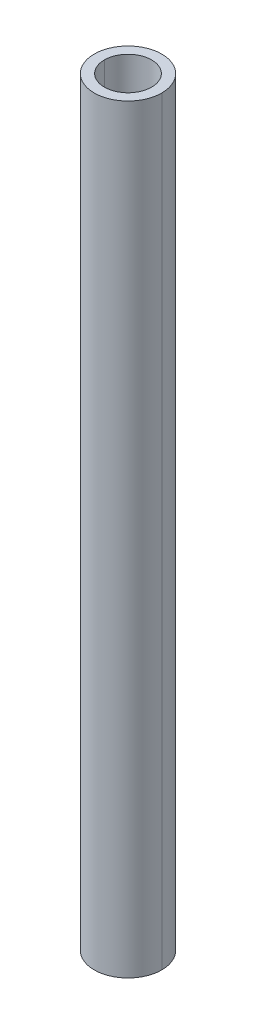
ISO-10303-21;
HEADER;
FILE_DESCRIPTION(('STEP AP214'),'2;1');
FILE_NAME('part.step','',(''),(''),'','','');
FILE_SCHEMA(('AUTOMOTIVE_DESIGN { 1 0 10303 214 1 1 1 1 }'));
ENDSEC;
DATA;
#1=APPLICATION_CONTEXT('core data for automotive mechanical design processes');
#2=APPLICATION_PROTOCOL_DEFINITION('international standard','automotive_design',2000,#1);
#3=PRODUCT_CONTEXT('',#1,'mechanical');
#4=PRODUCT('Part','Part','',(#3));
#5=PRODUCT_RELATED_PRODUCT_CATEGORY('part','',(#4));
#6=PRODUCT_DEFINITION_FORMATION('','',#4);
#7=PRODUCT_DEFINITION_CONTEXT('part definition',#1,'design');
#8=PRODUCT_DEFINITION('design','',#6,#7);
#9=PRODUCT_DEFINITION_SHAPE('','',#8);
#10=(LENGTH_UNIT() NAMED_UNIT(*) SI_UNIT(.MILLI.,.METRE.));
#11=(NAMED_UNIT(*) PLANE_ANGLE_UNIT() SI_UNIT($,.RADIAN.));
#12=(NAMED_UNIT(*) SI_UNIT($,.STERADIAN.) SOLID_ANGLE_UNIT());
#13=UNCERTAINTY_MEASURE_WITH_UNIT(LENGTH_MEASURE(1.E-05),#10,'distance_accuracy_value','');
#14=(GEOMETRIC_REPRESENTATION_CONTEXT(3) GLOBAL_UNCERTAINTY_ASSIGNED_CONTEXT((#13)) GLOBAL_UNIT_ASSIGNED_CONTEXT((#10,
#11,#12)) REPRESENTATION_CONTEXT('',''));
#15=CARTESIAN_POINT('',(0.,0.,0.));
#16=DIRECTION('',(0.,0.,1.));
#17=DIRECTION('',(1.,0.,0.));
#18=AXIS2_PLACEMENT_3D('',#15,#16,#17);
#19=CARTESIAN_POINT('',(98.9527027027026,199.398701769801,0.));
#20=DIRECTION('',(0.,1.,0.));
#21=DIRECTION('',(-1.,0.,0.));
#22=AXIS2_PLACEMENT_3D('',#19,#20,#21);
#23=CYLINDRICAL_SURFACE('',#22,10.);
#24=CARTESIAN_POINT('',(98.9527027027026,-103.885135135135,0.));
#25=DIRECTION('',(0.,1.,0.));
#26=DIRECTION('',(-1.,0.,0.));
#27=AXIS2_PLACEMENT_3D('',#24,#25,#26);
#28=CIRCLE('',#27,10.);
#29=CARTESIAN_POINT('',(88.9527027027027,-103.885135135135,0.));
#30=VERTEX_POINT('',#29);
#31=CARTESIAN_POINT('',(108.952702702703,-103.885135135135,0.));
#32=VERTEX_POINT('',#31);
#33=EDGE_CURVE('E11',#30,#32,#28,.T.);
#34=ORIENTED_EDGE('',*,*,#33,.T.);
#35=DIRECTION('',(0.,1.,0.));
#36=VECTOR('',#35,1.);
#37=CARTESIAN_POINT('',(108.952702702703,199.398701769801,0.));
#38=LINE('',#37,#36);
#39=CARTESIAN_POINT('',(108.952702702703,121.114864864865,0.));
#40=VERTEX_POINT('',#39);
#41=EDGE_CURVE('E28',#32,#40,#38,.T.);
#42=ORIENTED_EDGE('',*,*,#41,.T.);
#43=CARTESIAN_POINT('',(98.9527027027026,121.114864864865,0.));
#44=DIRECTION('',(0.,1.,0.));
#45=DIRECTION('',(-1.,0.,0.));
#46=AXIS2_PLACEMENT_3D('',#43,#44,#45);
#47=CIRCLE('',#46,10.);
#48=CARTESIAN_POINT('',(88.9527027027026,121.114864864865,0.));
#49=VERTEX_POINT('',#48);
#50=EDGE_CURVE('E59',#49,#40,#47,.T.);
#51=ORIENTED_EDGE('',*,*,#50,.F.);
#52=DIRECTION('',(0.,1.,0.));
#53=VECTOR('',#52,1.);
#54=CARTESIAN_POINT('',(88.9527027027026,199.398701769801,0.));
#55=LINE('',#54,#53);
#56=EDGE_CURVE('E21',#30,#49,#55,.T.);
#57=ORIENTED_EDGE('',*,*,#56,.F.);
#58=EDGE_LOOP('',(#34,#42,#51,#57));
#59=FACE_BOUND('',#58,.T.);
#60=ADVANCED_FACE('F17',(#59),#23,.T.);
#61=CARTESIAN_POINT('',(98.9527027027026,199.398701769801,0.));
#62=DIRECTION('',(0.,1.,0.));
#63=DIRECTION('',(-1.,0.,0.));
#64=AXIS2_PLACEMENT_3D('',#61,#62,#63);
#65=CYLINDRICAL_SURFACE('',#64,7.);
#66=CARTESIAN_POINT('',(98.9527027027026,-103.885135135135,0.));
#67=DIRECTION('',(0.,1.,0.));
#68=DIRECTION('',(-1.,0.,0.));
#69=AXIS2_PLACEMENT_3D('',#66,#67,#68);
#70=CIRCLE('',#69,7.);
#71=CARTESIAN_POINT('',(105.952702702703,-103.885135135135,0.));
#72=VERTEX_POINT('',#71);
#73=CARTESIAN_POINT('',(91.9527027027027,-103.885135135135,0.));
#74=VERTEX_POINT('',#73);
#75=EDGE_CURVE('E76',#72,#74,#70,.T.);
#76=ORIENTED_EDGE('',*,*,#75,.F.);
#77=DIRECTION('',(0.,1.,0.));
#78=VECTOR('',#77,1.);
#79=CARTESIAN_POINT('',(105.952702702703,199.398701769801,0.));
#80=LINE('',#79,#78);
#81=CARTESIAN_POINT('',(105.952702702703,121.114864864865,0.));
#82=VERTEX_POINT('',#81);
#83=EDGE_CURVE('E100',#72,#82,#80,.T.);
#84=ORIENTED_EDGE('',*,*,#83,.T.);
#85=CARTESIAN_POINT('',(98.9527027027026,121.114864864865,0.));
#86=DIRECTION('',(0.,1.,0.));
#87=DIRECTION('',(-1.,0.,0.));
#88=AXIS2_PLACEMENT_3D('',#85,#86,#87);
#89=CIRCLE('',#88,7.);
#90=CARTESIAN_POINT('',(91.9527027027026,121.114864864865,0.));
#91=VERTEX_POINT('',#90);
#92=EDGE_CURVE('E93',#82,#91,#89,.T.);
#93=ORIENTED_EDGE('',*,*,#92,.T.);
#94=DIRECTION('',(0.,1.,0.));
#95=VECTOR('',#94,1.);
#96=CARTESIAN_POINT('',(91.9527027027026,199.398701769801,0.));
#97=LINE('',#96,#95);
#98=EDGE_CURVE('E91',#74,#91,#97,.T.);
#99=ORIENTED_EDGE('',*,*,#98,.F.);
#100=EDGE_LOOP('',(#76,#84,#93,#99));
#101=FACE_BOUND('',#100,.T.);
#102=ADVANCED_FACE('F92',(#101),#65,.F.);
#103=CARTESIAN_POINT('',(98.9527027027026,199.398701769801,0.));
#104=DIRECTION('',(0.,1.,0.));
#105=DIRECTION('',(-1.,0.,0.));
#106=AXIS2_PLACEMENT_3D('',#103,#104,#105);
#107=CYLINDRICAL_SURFACE('',#106,7.);
#108=ORIENTED_EDGE('',*,*,#83,.F.);
#109=CARTESIAN_POINT('',(98.9527027027026,-103.885135135135,0.));
#110=DIRECTION('',(0.,1.,0.));
#111=DIRECTION('',(-1.,0.,0.));
#112=AXIS2_PLACEMENT_3D('',#109,#110,#111);
#113=CIRCLE('',#112,7.);
#114=EDGE_CURVE('E86',#74,#72,#113,.T.);
#115=ORIENTED_EDGE('',*,*,#114,.F.);
#116=ORIENTED_EDGE('',*,*,#98,.T.);
#117=CARTESIAN_POINT('',(98.9527027027026,121.114864864865,0.));
#118=DIRECTION('',(0.,1.,0.));
#119=DIRECTION('',(-1.,0.,0.));
#120=AXIS2_PLACEMENT_3D('',#117,#118,#119);
#121=CIRCLE('',#120,7.);
#122=EDGE_CURVE('E98',#91,#82,#121,.T.);
#123=ORIENTED_EDGE('',*,*,#122,.T.);
#124=EDGE_LOOP('',(#108,#115,#116,#123));
#125=FACE_BOUND('',#124,.T.);
#126=ADVANCED_FACE('F99',(#125),#107,.F.);
#127=CARTESIAN_POINT('',(108.952702702703,-103.885135135135,0.));
#128=DIRECTION('',(0.,-1.,0.));
#129=DIRECTION('',(0.,0.,-1.));
#130=AXIS2_PLACEMENT_3D('',#127,#128,#129);
#131=PLANE('',#130);
#132=ORIENTED_EDGE('',*,*,#33,.F.);
#133=CARTESIAN_POINT('',(98.9527027027026,-103.885135135135,0.));
#134=DIRECTION('',(0.,1.,0.));
#135=DIRECTION('',(-1.,0.,0.));
#136=AXIS2_PLACEMENT_3D('',#133,#134,#135);
#137=CIRCLE('',#136,10.);
#138=EDGE_CURVE('E88',#32,#30,#137,.T.);
#139=ORIENTED_EDGE('',*,*,#138,.F.);
#140=EDGE_LOOP('',(#132,#139));
#141=FACE_BOUND('',#140,.T.);
#142=ORIENTED_EDGE('',*,*,#114,.T.);
#143=ORIENTED_EDGE('',*,*,#75,.T.);
#144=EDGE_LOOP('',(#142,#143));
#145=FACE_BOUND('',#144,.T.);
#146=ADVANCED_FACE('F84',(#141,#145),#131,.T.);
#147=CARTESIAN_POINT('',(98.9527027027026,199.398701769801,0.));
#148=DIRECTION('',(0.,1.,0.));
#149=DIRECTION('',(-1.,0.,0.));
#150=AXIS2_PLACEMENT_3D('',#147,#148,#149);
#151=CYLINDRICAL_SURFACE('',#150,10.);
#152=ORIENTED_EDGE('',*,*,#41,.F.);
#153=ORIENTED_EDGE('',*,*,#138,.T.);
#154=ORIENTED_EDGE('',*,*,#56,.T.);
#155=CARTESIAN_POINT('',(98.9527027027026,121.114864864865,0.));
#156=DIRECTION('',(0.,1.,0.));
#157=DIRECTION('',(-1.,0.,0.));
#158=AXIS2_PLACEMENT_3D('',#155,#156,#157);
#159=CIRCLE('',#158,10.);
#160=EDGE_CURVE('E110',#40,#49,#159,.T.);
#161=ORIENTED_EDGE('',*,*,#160,.F.);
#162=EDGE_LOOP('',(#152,#153,#154,#161));
#163=FACE_BOUND('',#162,.T.);
#164=ADVANCED_FACE('F19',(#163),#151,.T.);
#165=CARTESIAN_POINT('',(105.952702702703,121.114864864865,0.));
#166=DIRECTION('',(0.,1.,0.));
#167=DIRECTION('',(1.,0.,0.));
#168=AXIS2_PLACEMENT_3D('',#165,#166,#167);
#169=PLANE('',#168);
#170=ORIENTED_EDGE('',*,*,#50,.T.);
#171=ORIENTED_EDGE('',*,*,#160,.T.);
#172=EDGE_LOOP('',(#170,#171));
#173=FACE_BOUND('',#172,.T.);
#174=ORIENTED_EDGE('',*,*,#122,.F.);
#175=ORIENTED_EDGE('',*,*,#92,.F.);
#176=EDGE_LOOP('',(#174,#175));
#177=FACE_BOUND('',#176,.T.);
#178=ADVANCED_FACE('F181',(#173,#177),#169,.T.);
#179=CLOSED_SHELL('',(#60,#102,#126,#146,#164,#178));
#180=MANIFOLD_SOLID_BREP('B1',#179);
#181=ADVANCED_BREP_SHAPE_REPRESENTATION('',(#18,#180),#14);
#182=SHAPE_DEFINITION_REPRESENTATION(#9,#181);
ENDSEC;
END-ISO-10303-21;
